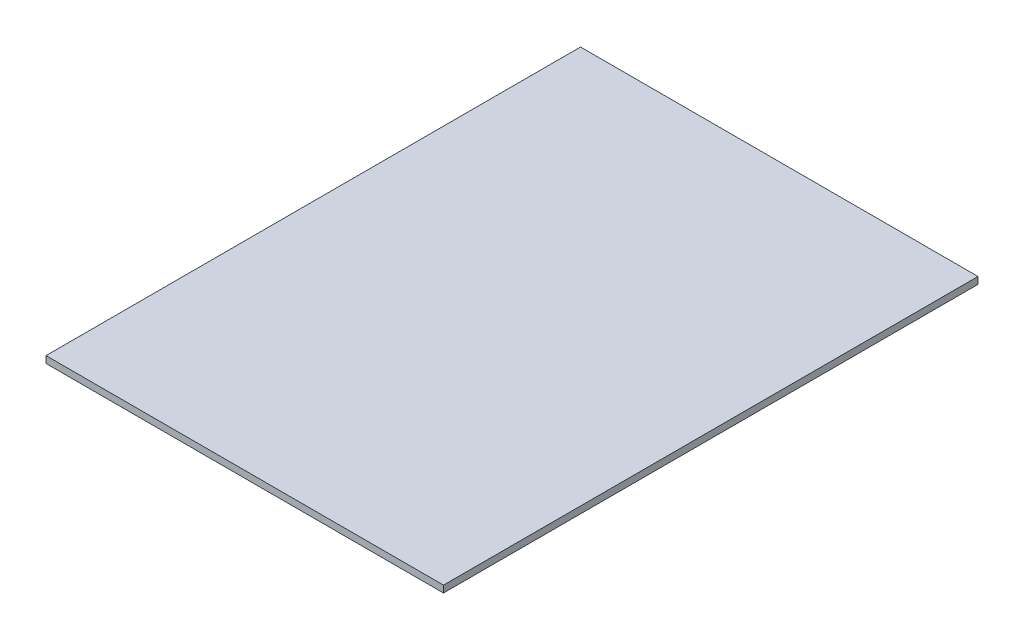
ISO-10303-21;
HEADER;
FILE_DESCRIPTION(('STEP AP214'),'2;1');
FILE_NAME('part.step','',(''),(''),'','','');
FILE_SCHEMA(('AUTOMOTIVE_DESIGN { 1 0 10303 214 1 1 1 1 }'));
ENDSEC;
DATA;
#1=APPLICATION_CONTEXT('core data for automotive mechanical design processes');
#2=APPLICATION_PROTOCOL_DEFINITION('international standard','automotive_design',2000,#1);
#3=PRODUCT_CONTEXT('',#1,'mechanical');
#4=PRODUCT('Part','Part','',(#3));
#5=PRODUCT_RELATED_PRODUCT_CATEGORY('part','',(#4));
#6=PRODUCT_DEFINITION_FORMATION('','',#4);
#7=PRODUCT_DEFINITION_CONTEXT('part definition',#1,'design');
#8=PRODUCT_DEFINITION('design','',#6,#7);
#9=PRODUCT_DEFINITION_SHAPE('','',#8);
#10=(LENGTH_UNIT() NAMED_UNIT(*) SI_UNIT(.MILLI.,.METRE.));
#11=(NAMED_UNIT(*) PLANE_ANGLE_UNIT() SI_UNIT($,.RADIAN.));
#12=(NAMED_UNIT(*) SI_UNIT($,.STERADIAN.) SOLID_ANGLE_UNIT());
#13=UNCERTAINTY_MEASURE_WITH_UNIT(LENGTH_MEASURE(1.E-05),#10,'distance_accuracy_value','');
#14=(GEOMETRIC_REPRESENTATION_CONTEXT(3) GLOBAL_UNCERTAINTY_ASSIGNED_CONTEXT((#13)) GLOBAL_UNIT_ASSIGNED_CONTEXT((#10,
#11,#12)) REPRESENTATION_CONTEXT('',''));
#15=CARTESIAN_POINT('',(0.,0.,0.));
#16=DIRECTION('',(0.,0.,1.));
#17=DIRECTION('',(1.,0.,0.));
#18=AXIS2_PLACEMENT_3D('',#15,#16,#17);
#19=CARTESIAN_POINT('',(-72.5,1.25,97.5));
#20=DIRECTION('',(0.,0.,-1.));
#21=DIRECTION('',(-1.,0.,0.));
#22=AXIS2_PLACEMENT_3D('',#19,#20,#21);
#23=PLANE('',#22);
#24=DIRECTION('',(1.,0.,0.));
#25=VECTOR('',#24,1.);
#26=CARTESIAN_POINT('',(-72.5,-1.25,97.5));
#27=LINE('',#26,#25);
#28=CARTESIAN_POINT('',(-72.5,-1.25,97.5));
#29=VERTEX_POINT('',#28);
#30=CARTESIAN_POINT('',(72.5,-1.25,97.5));
#31=VERTEX_POINT('',#30);
#32=EDGE_CURVE('E101',#29,#31,#27,.T.);
#33=ORIENTED_EDGE('',*,*,#32,.T.);
#34=DIRECTION('',(0.,-1.,0.));
#35=VECTOR('',#34,1.);
#36=CARTESIAN_POINT('',(72.5,1.25,97.5));
#37=LINE('',#36,#35);
#38=CARTESIAN_POINT('',(72.5,1.25,97.5));
#39=VERTEX_POINT('',#38);
#40=EDGE_CURVE('E11',#39,#31,#37,.T.);
#41=ORIENTED_EDGE('',*,*,#40,.F.);
#42=DIRECTION('',(1.,0.,0.));
#43=VECTOR('',#42,1.);
#44=CARTESIAN_POINT('',(-72.5,1.25,97.5));
#45=LINE('',#44,#43);
#46=CARTESIAN_POINT('',(-72.5,1.25,97.5));
#47=VERTEX_POINT('',#46);
#48=EDGE_CURVE('E78',#47,#39,#45,.T.);
#49=ORIENTED_EDGE('',*,*,#48,.F.);
#50=DIRECTION('',(0.,-1.,0.));
#51=VECTOR('',#50,1.);
#52=CARTESIAN_POINT('',(-72.5,1.25,97.5));
#53=LINE('',#52,#51);
#54=EDGE_CURVE('E97',#47,#29,#53,.T.);
#55=ORIENTED_EDGE('',*,*,#54,.T.);
#56=EDGE_LOOP('',(#33,#41,#49,#55));
#57=FACE_BOUND('',#56,.T.);
#58=ADVANCED_FACE('F39',(#57),#23,.F.);
#59=CARTESIAN_POINT('',(72.5,1.25,-97.5));
#60=DIRECTION('',(1.,0.,0.));
#61=DIRECTION('',(0.,0.,-1.));
#62=AXIS2_PLACEMENT_3D('',#59,#60,#61);
#63=PLANE('',#62);
#64=DIRECTION('',(0.,0.,1.));
#65=VECTOR('',#64,1.);
#66=CARTESIAN_POINT('',(72.5,-1.25,-97.5));
#67=LINE('',#66,#65);
#68=CARTESIAN_POINT('',(72.5,-1.25,-97.5));
#69=VERTEX_POINT('',#68);
#70=EDGE_CURVE('E87',#69,#31,#67,.T.);
#71=ORIENTED_EDGE('',*,*,#70,.F.);
#72=DIRECTION('',(0.,-1.,0.));
#73=VECTOR('',#72,1.);
#74=CARTESIAN_POINT('',(72.5,1.25,-97.5));
#75=LINE('',#74,#73);
#76=CARTESIAN_POINT('',(72.5,1.25,-97.5));
#77=VERTEX_POINT('',#76);
#78=EDGE_CURVE('E47',#77,#69,#75,.T.);
#79=ORIENTED_EDGE('',*,*,#78,.F.);
#80=DIRECTION('',(0.,0.,1.));
#81=VECTOR('',#80,1.);
#82=CARTESIAN_POINT('',(72.5,1.25,-97.5));
#83=LINE('',#82,#81);
#84=EDGE_CURVE('E85',#77,#39,#83,.T.);
#85=ORIENTED_EDGE('',*,*,#84,.T.);
#86=ORIENTED_EDGE('',*,*,#40,.T.);
#87=EDGE_LOOP('',(#71,#79,#85,#86));
#88=FACE_BOUND('',#87,.T.);
#89=ADVANCED_FACE('F84',(#88),#63,.T.);
#90=CARTESIAN_POINT('',(-72.5,1.25,-97.5));
#91=DIRECTION('',(0.,0.,-1.));
#92=DIRECTION('',(-1.,0.,0.));
#93=AXIS2_PLACEMENT_3D('',#90,#91,#92);
#94=PLANE('',#93);
#95=DIRECTION('',(1.,0.,0.));
#96=VECTOR('',#95,1.);
#97=CARTESIAN_POINT('',(-72.5,-1.25,-97.5));
#98=LINE('',#97,#96);
#99=CARTESIAN_POINT('',(-72.5,-1.25,-97.5));
#100=VERTEX_POINT('',#99);
#101=EDGE_CURVE('E105',#100,#69,#98,.T.);
#102=ORIENTED_EDGE('',*,*,#101,.F.);
#103=DIRECTION('',(0.,-1.,0.));
#104=VECTOR('',#103,1.);
#105=CARTESIAN_POINT('',(-72.5,1.25,-97.5));
#106=LINE('',#105,#104);
#107=CARTESIAN_POINT('',(-72.5,1.25,-97.5));
#108=VERTEX_POINT('',#107);
#109=EDGE_CURVE('E70',#108,#100,#106,.T.);
#110=ORIENTED_EDGE('',*,*,#109,.F.);
#111=DIRECTION('',(1.,0.,0.));
#112=VECTOR('',#111,1.);
#113=CARTESIAN_POINT('',(-72.5,1.25,-97.5));
#114=LINE('',#113,#112);
#115=EDGE_CURVE('E93',#108,#77,#114,.T.);
#116=ORIENTED_EDGE('',*,*,#115,.T.);
#117=ORIENTED_EDGE('',*,*,#78,.T.);
#118=EDGE_LOOP('',(#102,#110,#116,#117));
#119=FACE_BOUND('',#118,.T.);
#120=ADVANCED_FACE('F95',(#119),#94,.T.);
#121=CARTESIAN_POINT('',(-72.5,1.25,-97.5));
#122=DIRECTION('',(1.,0.,0.));
#123=DIRECTION('',(0.,0.,-1.));
#124=AXIS2_PLACEMENT_3D('',#121,#122,#123);
#125=PLANE('',#124);
#126=DIRECTION('',(0.,0.,1.));
#127=VECTOR('',#126,1.);
#128=CARTESIAN_POINT('',(-72.5,-1.25,-97.5));
#129=LINE('',#128,#127);
#130=EDGE_CURVE('E73',#100,#29,#129,.T.);
#131=ORIENTED_EDGE('',*,*,#130,.T.);
#132=ORIENTED_EDGE('',*,*,#54,.F.);
#133=DIRECTION('',(0.,0.,1.));
#134=VECTOR('',#133,1.);
#135=CARTESIAN_POINT('',(-72.5,1.25,-97.5));
#136=LINE('',#135,#134);
#137=EDGE_CURVE('E55',#108,#47,#136,.T.);
#138=ORIENTED_EDGE('',*,*,#137,.F.);
#139=ORIENTED_EDGE('',*,*,#109,.T.);
#140=EDGE_LOOP('',(#131,#132,#138,#139));
#141=FACE_BOUND('',#140,.T.);
#142=ADVANCED_FACE('F118',(#141),#125,.F.);
#143=CARTESIAN_POINT('',(0.,1.25,0.));
#144=DIRECTION('',(0.,-1.,0.));
#145=DIRECTION('',(0.,0.,-1.));
#146=AXIS2_PLACEMENT_3D('',#143,#144,#145);
#147=PLANE('',#146);
#148=ORIENTED_EDGE('',*,*,#48,.T.);
#149=ORIENTED_EDGE('',*,*,#84,.F.);
#150=ORIENTED_EDGE('',*,*,#115,.F.);
#151=ORIENTED_EDGE('',*,*,#137,.T.);
#152=EDGE_LOOP('',(#148,#149,#150,#151));
#153=FACE_BOUND('',#152,.T.);
#154=ADVANCED_FACE('F92',(#153),#147,.F.);
#155=CARTESIAN_POINT('',(0.,-1.25,0.));
#156=DIRECTION('',(0.,-1.,0.));
#157=DIRECTION('',(0.,0.,-1.));
#158=AXIS2_PLACEMENT_3D('',#155,#156,#157);
#159=PLANE('',#158);
#160=ORIENTED_EDGE('',*,*,#32,.F.);
#161=ORIENTED_EDGE('',*,*,#130,.F.);
#162=ORIENTED_EDGE('',*,*,#101,.T.);
#163=ORIENTED_EDGE('',*,*,#70,.T.);
#164=EDGE_LOOP('',(#160,#161,#162,#163));
#165=FACE_BOUND('',#164,.T.);
#166=ADVANCED_FACE('F112',(#165),#159,.T.);
#167=CLOSED_SHELL('',(#58,#89,#120,#142,#154,#166));
#168=MANIFOLD_SOLID_BREP('B2',#167);
#169=ADVANCED_BREP_SHAPE_REPRESENTATION('',(#18,#168),#14);
#170=SHAPE_DEFINITION_REPRESENTATION(#9,#169);
ENDSEC;
END-ISO-10303-21;
